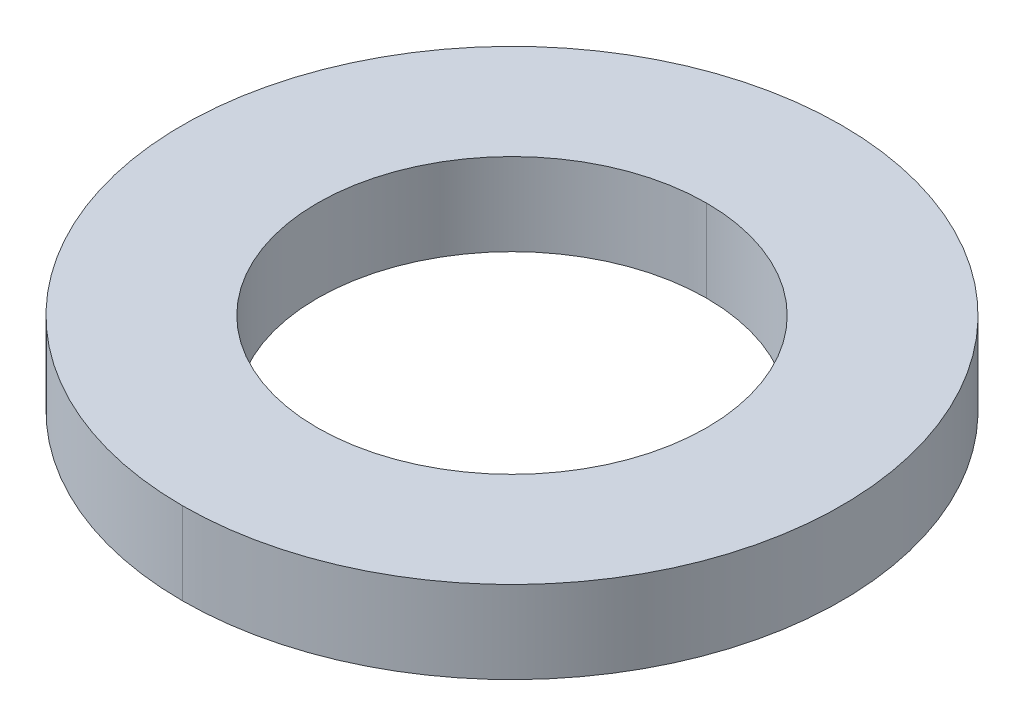
ISO-10303-21;
HEADER;
FILE_DESCRIPTION(('STEP AP214'),'2;1');
FILE_NAME('part.step','',(''),(''),'','','');
FILE_SCHEMA(('AUTOMOTIVE_DESIGN { 1 0 10303 214 1 1 1 1 }'));
ENDSEC;
DATA;
#1=APPLICATION_CONTEXT('core data for automotive mechanical design processes');
#2=APPLICATION_PROTOCOL_DEFINITION('international standard','automotive_design',2000,#1);
#3=PRODUCT_CONTEXT('',#1,'mechanical');
#4=PRODUCT('Part','Part','',(#3));
#5=PRODUCT_RELATED_PRODUCT_CATEGORY('part','',(#4));
#6=PRODUCT_DEFINITION_FORMATION('','',#4);
#7=PRODUCT_DEFINITION_CONTEXT('part definition',#1,'design');
#8=PRODUCT_DEFINITION('design','',#6,#7);
#9=PRODUCT_DEFINITION_SHAPE('','',#8);
#10=(LENGTH_UNIT() NAMED_UNIT(*) SI_UNIT(.MILLI.,.METRE.));
#11=(NAMED_UNIT(*) PLANE_ANGLE_UNIT() SI_UNIT($,.RADIAN.));
#12=(NAMED_UNIT(*) SI_UNIT($,.STERADIAN.) SOLID_ANGLE_UNIT());
#13=UNCERTAINTY_MEASURE_WITH_UNIT(LENGTH_MEASURE(1.E-05),#10,'distance_accuracy_value','');
#14=(GEOMETRIC_REPRESENTATION_CONTEXT(3) GLOBAL_UNCERTAINTY_ASSIGNED_CONTEXT((#13)) GLOBAL_UNIT_ASSIGNED_CONTEXT((#10,
#11,#12)) REPRESENTATION_CONTEXT('',''));
#15=CARTESIAN_POINT('',(0.,0.,0.));
#16=DIRECTION('',(0.,0.,1.));
#17=DIRECTION('',(1.,0.,0.));
#18=AXIS2_PLACEMENT_3D('',#15,#16,#17);
#19=CARTESIAN_POINT('',(0.,-0.79375,0.));
#20=DIRECTION('',(0.,1.,0.));
#21=DIRECTION('',(1.,0.,0.));
#22=AXIS2_PLACEMENT_3D('',#19,#20,#21);
#23=PLANE('',#22);
#24=CARTESIAN_POINT('',(0.,-0.79375,0.));
#25=DIRECTION('',(0.,1.,0.));
#26=DIRECTION('',(0.,0.,-1.));
#27=AXIS2_PLACEMENT_3D('',#24,#25,#26);
#28=CIRCLE('',#27,3.75);
#29=CARTESIAN_POINT('',(0.,-0.79375,-3.75));
#30=VERTEX_POINT('',#29);
#31=CARTESIAN_POINT('',(0.,-0.79375,3.75));
#32=VERTEX_POINT('',#31);
#33=EDGE_CURVE('E85',#30,#32,#28,.T.);
#34=ORIENTED_EDGE('',*,*,#33,.T.);
#35=CARTESIAN_POINT('',(0.,-0.79375,0.));
#36=DIRECTION('',(0.,1.,0.));
#37=DIRECTION('',(0.,0.,-1.));
#38=AXIS2_PLACEMENT_3D('',#35,#36,#37);
#39=CIRCLE('',#38,3.75);
#40=EDGE_CURVE('E27',#32,#30,#39,.T.);
#41=ORIENTED_EDGE('',*,*,#40,.T.);
#42=EDGE_LOOP('',(#34,#41));
#43=FACE_BOUND('',#42,.T.);
#44=CARTESIAN_POINT('',(0.,-0.79375,0.));
#45=DIRECTION('',(0.,1.,0.));
#46=DIRECTION('',(0.,0.,-1.));
#47=AXIS2_PLACEMENT_3D('',#44,#45,#46);
#48=CIRCLE('',#47,6.35);
#49=CARTESIAN_POINT('',(0.,-0.79375,-6.35));
#50=VERTEX_POINT('',#49);
#51=CARTESIAN_POINT('',(0.,-0.79375,6.35));
#52=VERTEX_POINT('',#51);
#53=EDGE_CURVE('E11',#50,#52,#48,.T.);
#54=ORIENTED_EDGE('',*,*,#53,.F.);
#55=CARTESIAN_POINT('',(0.,-0.79375,0.));
#56=DIRECTION('',(0.,1.,0.));
#57=DIRECTION('',(0.,0.,-1.));
#58=AXIS2_PLACEMENT_3D('',#55,#56,#57);
#59=CIRCLE('',#58,6.35);
#60=EDGE_CURVE('E93',#52,#50,#59,.T.);
#61=ORIENTED_EDGE('',*,*,#60,.F.);
#62=EDGE_LOOP('',(#54,#61));
#63=FACE_BOUND('',#62,.T.);
#64=ADVANCED_FACE('F16',(#43,#63),#23,.F.);
#65=CARTESIAN_POINT('',(0.,0.79375,0.));
#66=DIRECTION('',(0.,-1.,0.));
#67=DIRECTION('',(0.,0.,-1.));
#68=AXIS2_PLACEMENT_3D('',#65,#66,#67);
#69=CYLINDRICAL_SURFACE('',#68,6.35);
#70=DIRECTION('',(0.,-1.,0.));
#71=VECTOR('',#70,1.);
#72=CARTESIAN_POINT('',(0.,0.79375,6.35));
#73=LINE('',#72,#71);
#74=CARTESIAN_POINT('',(0.,0.79375,6.35));
#75=VERTEX_POINT('',#74);
#76=EDGE_CURVE('E97',#75,#52,#73,.T.);
#77=ORIENTED_EDGE('',*,*,#76,.F.);
#78=CARTESIAN_POINT('',(0.,0.79375,0.));
#79=DIRECTION('',(0.,1.,0.));
#80=DIRECTION('',(0.,0.,-1.));
#81=AXIS2_PLACEMENT_3D('',#78,#79,#80);
#82=CIRCLE('',#81,6.35);
#83=CARTESIAN_POINT('',(0.,0.79375,-6.35));
#84=VERTEX_POINT('',#83);
#85=EDGE_CURVE('E76',#84,#75,#82,.T.);
#86=ORIENTED_EDGE('',*,*,#85,.F.);
#87=DIRECTION('',(0.,-1.,0.));
#88=VECTOR('',#87,1.);
#89=CARTESIAN_POINT('',(0.,0.79375,-6.35));
#90=LINE('',#89,#88);
#91=EDGE_CURVE('E96',#84,#50,#90,.T.);
#92=ORIENTED_EDGE('',*,*,#91,.T.);
#93=ORIENTED_EDGE('',*,*,#53,.T.);
#94=EDGE_LOOP('',(#77,#86,#92,#93));
#95=FACE_BOUND('',#94,.T.);
#96=ADVANCED_FACE('F173',(#95),#69,.T.);
#97=CARTESIAN_POINT('',(0.,0.79375,0.));
#98=DIRECTION('',(0.,-1.,0.));
#99=DIRECTION('',(0.,0.,-1.));
#100=AXIS2_PLACEMENT_3D('',#97,#98,#99);
#101=CYLINDRICAL_SURFACE('',#100,3.75);
#102=DIRECTION('',(0.,-1.,0.));
#103=VECTOR('',#102,1.);
#104=CARTESIAN_POINT('',(0.,0.79375,3.75));
#105=LINE('',#104,#103);
#106=CARTESIAN_POINT('',(0.,0.79375,3.75));
#107=VERTEX_POINT('',#106);
#108=EDGE_CURVE('E79',#107,#32,#105,.T.);
#109=ORIENTED_EDGE('',*,*,#108,.F.);
#110=CARTESIAN_POINT('',(0.,0.79375,0.));
#111=DIRECTION('',(0.,-1.,0.));
#112=DIRECTION('',(0.,0.,-1.));
#113=AXIS2_PLACEMENT_3D('',#110,#111,#112);
#114=CIRCLE('',#113,3.75);
#115=CARTESIAN_POINT('',(0.,0.79375,-3.75));
#116=VERTEX_POINT('',#115);
#117=EDGE_CURVE('E66',#116,#107,#114,.T.);
#118=ORIENTED_EDGE('',*,*,#117,.F.);
#119=DIRECTION('',(0.,-1.,0.));
#120=VECTOR('',#119,1.);
#121=CARTESIAN_POINT('',(0.,0.79375,-3.75));
#122=LINE('',#121,#120);
#123=EDGE_CURVE('E20',#116,#30,#122,.T.);
#124=ORIENTED_EDGE('',*,*,#123,.T.);
#125=ORIENTED_EDGE('',*,*,#40,.F.);
#126=EDGE_LOOP('',(#109,#118,#124,#125));
#127=FACE_BOUND('',#126,.T.);
#128=ADVANCED_FACE('F80',(#127),#101,.F.);
#129=CARTESIAN_POINT('',(0.,0.79375,0.));
#130=DIRECTION('',(0.,1.,0.));
#131=DIRECTION('',(1.,0.,0.));
#132=AXIS2_PLACEMENT_3D('',#129,#130,#131);
#133=PLANE('',#132);
#134=ORIENTED_EDGE('',*,*,#117,.T.);
#135=CARTESIAN_POINT('',(0.,0.79375,0.));
#136=DIRECTION('',(0.,-1.,0.));
#137=DIRECTION('',(0.,0.,-1.));
#138=AXIS2_PLACEMENT_3D('',#135,#136,#137);
#139=CIRCLE('',#138,3.75);
#140=EDGE_CURVE('E71',#107,#116,#139,.T.);
#141=ORIENTED_EDGE('',*,*,#140,.T.);
#142=EDGE_LOOP('',(#134,#141));
#143=FACE_BOUND('',#142,.T.);
#144=ORIENTED_EDGE('',*,*,#85,.T.);
#145=CARTESIAN_POINT('',(0.,0.79375,0.));
#146=DIRECTION('',(0.,1.,0.));
#147=DIRECTION('',(0.,0.,-1.));
#148=AXIS2_PLACEMENT_3D('',#145,#146,#147);
#149=CIRCLE('',#148,6.35);
#150=EDGE_CURVE('E101',#75,#84,#149,.T.);
#151=ORIENTED_EDGE('',*,*,#150,.T.);
#152=EDGE_LOOP('',(#144,#151));
#153=FACE_BOUND('',#152,.T.);
#154=ADVANCED_FACE('F68',(#143,#153),#133,.T.);
#155=CARTESIAN_POINT('',(0.,0.79375,0.));
#156=DIRECTION('',(0.,-1.,0.));
#157=DIRECTION('',(0.,0.,-1.));
#158=AXIS2_PLACEMENT_3D('',#155,#156,#157);
#159=CYLINDRICAL_SURFACE('',#158,6.35);
#160=ORIENTED_EDGE('',*,*,#150,.F.);
#161=ORIENTED_EDGE('',*,*,#76,.T.);
#162=ORIENTED_EDGE('',*,*,#60,.T.);
#163=ORIENTED_EDGE('',*,*,#91,.F.);
#164=EDGE_LOOP('',(#160,#161,#162,#163));
#165=FACE_BOUND('',#164,.T.);
#166=ADVANCED_FACE('F181',(#165),#159,.T.);
#167=CARTESIAN_POINT('',(0.,0.79375,0.));
#168=DIRECTION('',(0.,-1.,0.));
#169=DIRECTION('',(0.,0.,-1.));
#170=AXIS2_PLACEMENT_3D('',#167,#168,#169);
#171=CYLINDRICAL_SURFACE('',#170,3.75);
#172=ORIENTED_EDGE('',*,*,#140,.F.);
#173=ORIENTED_EDGE('',*,*,#108,.T.);
#174=ORIENTED_EDGE('',*,*,#33,.F.);
#175=ORIENTED_EDGE('',*,*,#123,.F.);
#176=EDGE_LOOP('',(#172,#173,#174,#175));
#177=FACE_BOUND('',#176,.T.);
#178=ADVANCED_FACE('F18',(#177),#171,.F.);
#179=CLOSED_SHELL('',(#64,#96,#128,#154,#166,#178));
#180=MANIFOLD_SOLID_BREP('B1',#179);
#181=ADVANCED_BREP_SHAPE_REPRESENTATION('',(#18,#180),#14);
#182=SHAPE_DEFINITION_REPRESENTATION(#9,#181);
ENDSEC;
END-ISO-10303-21;
